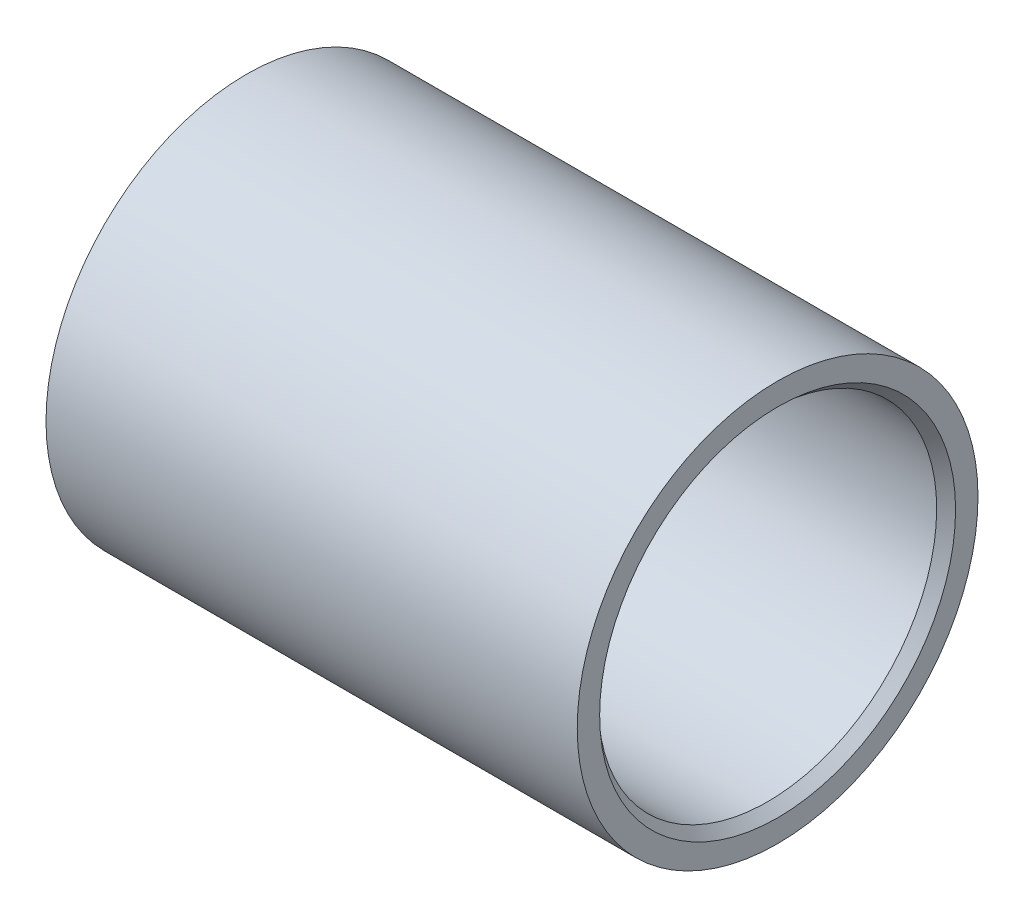
ISO-10303-21;
HEADER;
FILE_DESCRIPTION(('STEP AP214'),'2;1');
FILE_NAME('part.step','',(''),(''),'','','');
FILE_SCHEMA(('AUTOMOTIVE_DESIGN { 1 0 10303 214 1 1 1 1 }'));
ENDSEC;
DATA;
#1=APPLICATION_CONTEXT('core data for automotive mechanical design processes');
#2=APPLICATION_PROTOCOL_DEFINITION('international standard','automotive_design',2000,#1);
#3=PRODUCT_CONTEXT('',#1,'mechanical');
#4=PRODUCT('Part','Part','',(#3));
#5=PRODUCT_RELATED_PRODUCT_CATEGORY('part','',(#4));
#6=PRODUCT_DEFINITION_FORMATION('','',#4);
#7=PRODUCT_DEFINITION_CONTEXT('part definition',#1,'design');
#8=PRODUCT_DEFINITION('design','',#6,#7);
#9=PRODUCT_DEFINITION_SHAPE('','',#8);
#10=(LENGTH_UNIT() NAMED_UNIT(*) SI_UNIT(.MILLI.,.METRE.));
#11=(NAMED_UNIT(*) PLANE_ANGLE_UNIT() SI_UNIT($,.RADIAN.));
#12=(NAMED_UNIT(*) SI_UNIT($,.STERADIAN.) SOLID_ANGLE_UNIT());
#13=UNCERTAINTY_MEASURE_WITH_UNIT(LENGTH_MEASURE(1.E-05),#10,'distance_accuracy_value','');
#14=(GEOMETRIC_REPRESENTATION_CONTEXT(3) GLOBAL_UNCERTAINTY_ASSIGNED_CONTEXT((#13)) GLOBAL_UNIT_ASSIGNED_CONTEXT((#10,
#11,#12)) REPRESENTATION_CONTEXT('',''));
#15=CARTESIAN_POINT('',(0.,0.,0.));
#16=DIRECTION('',(0.,0.,1.));
#17=DIRECTION('',(1.,0.,0.));
#18=AXIS2_PLACEMENT_3D('',#15,#16,#17);
#19=CARTESIAN_POINT('',(20.5694573370838,0.,0.));
#20=DIRECTION('',(1.,0.,0.));
#21=DIRECTION('',(0.,1.,0.));
#22=AXIS2_PLACEMENT_3D('',#19,#20,#21);
#23=CYLINDRICAL_SURFACE('',#22,12.7381);
#24=CARTESIAN_POINT('',(20.5694573370838,0.,0.));
#25=DIRECTION('',(1.,0.,0.));
#26=DIRECTION('',(0.,-0.740799670457901,-0.671726021715301));
#27=AXIS2_PLACEMENT_3D('',#24,#25,#26);
#28=CIRCLE('',#27,12.7381);
#29=CARTESIAN_POINT('',(20.5694573370838,-9.43638028225979,-8.55651323721168));
#30=VERTEX_POINT('',#29);
#31=EDGE_CURVE('E49',#30,#30,#28,.T.);
#32=ORIENTED_EDGE('',*,*,#31,.T.);
#33=EDGE_LOOP('',(#32));
#34=FACE_BOUND('',#33,.T.);
#35=CARTESIAN_POINT('',(-17.9039573408138,0.,0.));
#36=DIRECTION('',(-1.,0.,0.));
#37=DIRECTION('',(0.,0.740799670457901,0.671726021715301));
#38=AXIS2_PLACEMENT_3D('',#35,#36,#37);
#39=CIRCLE('',#38,12.7381);
#40=CARTESIAN_POINT('',(-17.9039573408138,9.43638028225979,8.55651323721168));
#41=VERTEX_POINT('',#40);
#42=EDGE_CURVE('E44',#41,#41,#39,.T.);
#43=ORIENTED_EDGE('',*,*,#42,.T.);
#44=EDGE_LOOP('',(#43));
#45=FACE_BOUND('',#44,.T.);
#46=ADVANCED_FACE('F18',(#34,#45),#23,.F.);
#47=CARTESIAN_POINT('',(21.3314573370838,0.,0.));
#48=DIRECTION('',(1.,0.,0.));
#49=DIRECTION('',(0.,1.,0.));
#50=AXIS2_PLACEMENT_3D('',#47,#48,#49);
#51=CONICAL_SURFACE('',#50,13.3993705587191,0.714742753024015);
#52=ORIENTED_EDGE('',*,*,#31,.F.);
#53=EDGE_LOOP('',(#52));
#54=FACE_BOUND('',#53,.T.);
#55=CARTESIAN_POINT('',(21.3314573370838,0.,0.));
#56=DIRECTION('',(1.,0.,0.));
#57=DIRECTION('',(0.,1.,0.));
#58=AXIS2_PLACEMENT_3D('',#55,#56,#57);
#59=CIRCLE('',#58,13.3993705587191);
#60=CARTESIAN_POINT('',(21.3314573370838,13.3993705587191,0.));
#61=VERTEX_POINT('',#60);
#62=EDGE_CURVE('E21',#61,#61,#59,.F.);
#63=ORIENTED_EDGE('',*,*,#62,.F.);
#64=EDGE_LOOP('',(#63));
#65=FACE_BOUND('',#64,.T.);
#66=ADVANCED_FACE('F62',(#54,#65),#51,.F.);
#67=CARTESIAN_POINT('',(-18.6685426629161,0.,0.));
#68=DIRECTION('',(-1.,0.,0.));
#69=DIRECTION('',(0.,0.,1.));
#70=AXIS2_PLACEMENT_3D('',#67,#68,#69);
#71=CONICAL_SURFACE('',#70,13.5026853221025,0.785398163397606);
#72=CARTESIAN_POINT('',(-18.6685426629161,0.,0.));
#73=DIRECTION('',(-1.,0.,0.));
#74=DIRECTION('',(0.,0.,1.));
#75=AXIS2_PLACEMENT_3D('',#72,#73,#74);
#76=CIRCLE('',#75,13.5026853221025);
#77=CARTESIAN_POINT('',(-18.6685426629161,0.,13.5026853221025));
#78=VERTEX_POINT('',#77);
#79=EDGE_CURVE('E32',#78,#78,#76,.F.);
#80=ORIENTED_EDGE('',*,*,#79,.F.);
#81=EDGE_LOOP('',(#80));
#82=FACE_BOUND('',#81,.T.);
#83=ORIENTED_EDGE('',*,*,#42,.F.);
#84=EDGE_LOOP('',(#83));
#85=FACE_BOUND('',#84,.T.);
#86=ADVANCED_FACE('F65',(#82,#85),#71,.F.);
#87=CARTESIAN_POINT('',(21.3314573370838,21.5673621048312,-1.05466144976208));
#88=DIRECTION('',(1.,0.,0.));
#89=DIRECTION('',(0.,0.,-1.));
#90=AXIS2_PLACEMENT_3D('',#87,#88,#89);
#91=PLANE('',#90);
#92=CARTESIAN_POINT('',(21.3314573370838,0.,0.));
#93=DIRECTION('',(1.,0.,0.));
#94=DIRECTION('',(0.,1.,0.));
#95=AXIS2_PLACEMENT_3D('',#92,#93,#94);
#96=CIRCLE('',#95,15.0876);
#97=CARTESIAN_POINT('',(21.3314573370838,15.0876,0.));
#98=VERTEX_POINT('',#97);
#99=EDGE_CURVE('E26',#98,#98,#96,.F.);
#100=ORIENTED_EDGE('',*,*,#99,.F.);
#101=EDGE_LOOP('',(#100));
#102=FACE_BOUND('',#101,.T.);
#103=ORIENTED_EDGE('',*,*,#62,.T.);
#104=EDGE_LOOP('',(#103));
#105=FACE_BOUND('',#104,.T.);
#106=ADVANCED_FACE('F70',(#102,#105),#91,.T.);
#107=CARTESIAN_POINT('',(-18.6685426629162,1.05466144976208,21.5673621048312));
#108=DIRECTION('',(-1.,0.,0.));
#109=DIRECTION('',(0.,0.,1.));
#110=AXIS2_PLACEMENT_3D('',#107,#108,#109);
#111=PLANE('',#110);
#112=CARTESIAN_POINT('',(-18.6685426629162,0.,0.));
#113=DIRECTION('',(1.,0.,0.));
#114=DIRECTION('',(0.,1.,0.));
#115=AXIS2_PLACEMENT_3D('',#112,#113,#114);
#116=CIRCLE('',#115,15.0876);
#117=CARTESIAN_POINT('',(-18.6685426629162,15.0876,0.));
#118=VERTEX_POINT('',#117);
#119=EDGE_CURVE('E11',#118,#118,#116,.T.);
#120=ORIENTED_EDGE('',*,*,#119,.F.);
#121=EDGE_LOOP('',(#120));
#122=FACE_BOUND('',#121,.T.);
#123=ORIENTED_EDGE('',*,*,#79,.T.);
#124=EDGE_LOOP('',(#123));
#125=FACE_BOUND('',#124,.T.);
#126=ADVANCED_FACE('F75',(#122,#125),#111,.T.);
#127=CARTESIAN_POINT('',(21.3314573370838,0.,0.));
#128=DIRECTION('',(1.,0.,0.));
#129=DIRECTION('',(0.,1.,0.));
#130=AXIS2_PLACEMENT_3D('',#127,#128,#129);
#131=CYLINDRICAL_SURFACE('',#130,15.0876);
#132=ORIENTED_EDGE('',*,*,#119,.T.);
#133=EDGE_LOOP('',(#132));
#134=FACE_BOUND('',#133,.T.);
#135=ORIENTED_EDGE('',*,*,#99,.T.);
#136=EDGE_LOOP('',(#135));
#137=FACE_BOUND('',#136,.T.);
#138=ADVANCED_FACE('F73',(#134,#137),#131,.T.);
#139=CLOSED_SHELL('',(#46,#66,#86,#106,#126,#138));
#140=MANIFOLD_SOLID_BREP('B1',#139);
#141=ADVANCED_BREP_SHAPE_REPRESENTATION('',(#18,#140),#14);
#142=SHAPE_DEFINITION_REPRESENTATION(#9,#141);
ENDSEC;
END-ISO-10303-21;
